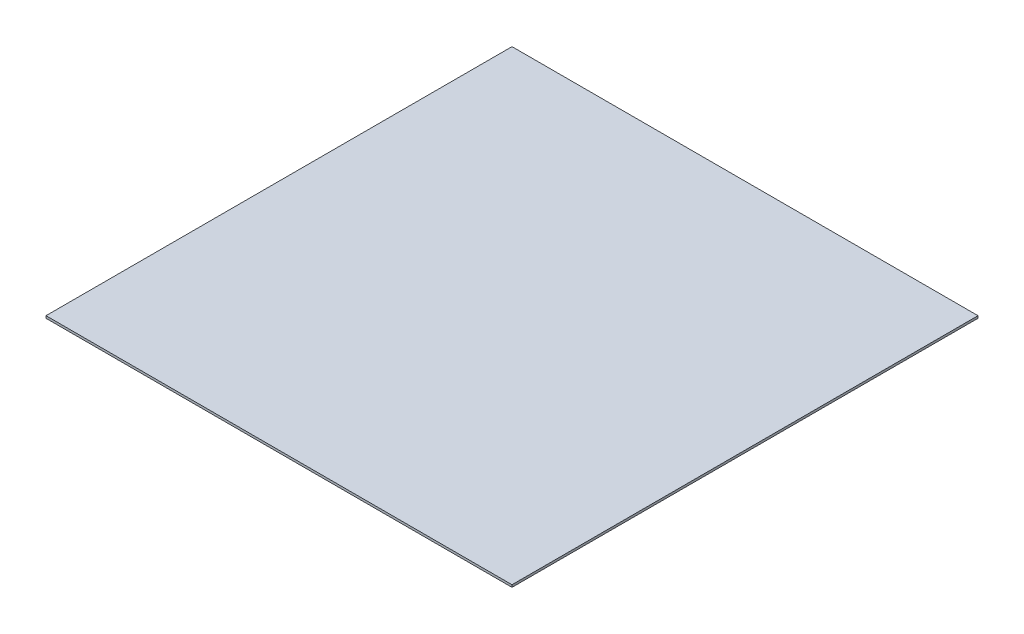
ISO-10303-21;
HEADER;
FILE_DESCRIPTION(('STEP AP214'),'2;1');
FILE_NAME('part.step','',(''),(''),'','','');
FILE_SCHEMA(('AUTOMOTIVE_DESIGN { 1 0 10303 214 1 1 1 1 }'));
ENDSEC;
DATA;
#1=APPLICATION_CONTEXT('core data for automotive mechanical design processes');
#2=APPLICATION_PROTOCOL_DEFINITION('international standard','automotive_design',2000,#1);
#3=PRODUCT_CONTEXT('',#1,'mechanical');
#4=PRODUCT('Part','Part','',(#3));
#5=PRODUCT_RELATED_PRODUCT_CATEGORY('part','',(#4));
#6=PRODUCT_DEFINITION_FORMATION('','',#4);
#7=PRODUCT_DEFINITION_CONTEXT('part definition',#1,'design');
#8=PRODUCT_DEFINITION('design','',#6,#7);
#9=PRODUCT_DEFINITION_SHAPE('','',#8);
#10=(LENGTH_UNIT() NAMED_UNIT(*) SI_UNIT(.MILLI.,.METRE.));
#11=(NAMED_UNIT(*) PLANE_ANGLE_UNIT() SI_UNIT($,.RADIAN.));
#12=(NAMED_UNIT(*) SI_UNIT($,.STERADIAN.) SOLID_ANGLE_UNIT());
#13=UNCERTAINTY_MEASURE_WITH_UNIT(LENGTH_MEASURE(1.E-05),#10,'distance_accuracy_value','');
#14=(GEOMETRIC_REPRESENTATION_CONTEXT(3) GLOBAL_UNCERTAINTY_ASSIGNED_CONTEXT((#13)) GLOBAL_UNIT_ASSIGNED_CONTEXT((#10,
#11,#12)) REPRESENTATION_CONTEXT('',''));
#15=CARTESIAN_POINT('',(0.,0.,0.));
#16=DIRECTION('',(0.,0.,1.));
#17=DIRECTION('',(1.,0.,0.));
#18=AXIS2_PLACEMENT_3D('',#15,#16,#17);
#19=CARTESIAN_POINT('',(-152.,1.5,152.));
#20=DIRECTION('',(1.,0.,0.));
#21=DIRECTION('',(0.,0.,-1.));
#22=AXIS2_PLACEMENT_3D('',#19,#20,#21);
#23=PLANE('',#22);
#24=DIRECTION('',(0.,0.,1.));
#25=VECTOR('',#24,1.);
#26=CARTESIAN_POINT('',(-152.,0.,152.));
#27=LINE('',#26,#25);
#28=CARTESIAN_POINT('',(-152.,0.,-152.));
#29=VERTEX_POINT('',#28);
#30=CARTESIAN_POINT('',(-152.,0.,152.));
#31=VERTEX_POINT('',#30);
#32=EDGE_CURVE('E97',#29,#31,#27,.T.);
#33=ORIENTED_EDGE('',*,*,#32,.T.);
#34=DIRECTION('',(0.,-1.,0.));
#35=VECTOR('',#34,1.);
#36=CARTESIAN_POINT('',(-152.,1.5,152.));
#37=LINE('',#36,#35);
#38=CARTESIAN_POINT('',(-152.,1.5,152.));
#39=VERTEX_POINT('',#38);
#40=EDGE_CURVE('E11',#39,#31,#37,.T.);
#41=ORIENTED_EDGE('',*,*,#40,.F.);
#42=DIRECTION('',(0.,0.,1.));
#43=VECTOR('',#42,1.);
#44=CARTESIAN_POINT('',(-152.,1.5,152.));
#45=LINE('',#44,#43);
#46=CARTESIAN_POINT('',(-152.,1.5,-152.));
#47=VERTEX_POINT('',#46);
#48=EDGE_CURVE('E85',#47,#39,#45,.T.);
#49=ORIENTED_EDGE('',*,*,#48,.F.);
#50=DIRECTION('',(0.,-1.,0.));
#51=VECTOR('',#50,1.);
#52=CARTESIAN_POINT('',(-152.,1.5,-152.));
#53=LINE('',#52,#51);
#54=EDGE_CURVE('E93',#47,#29,#53,.T.);
#55=ORIENTED_EDGE('',*,*,#54,.T.);
#56=EDGE_LOOP('',(#33,#41,#49,#55));
#57=FACE_BOUND('',#56,.T.);
#58=ADVANCED_FACE('F34',(#57),#23,.F.);
#59=CARTESIAN_POINT('',(152.,1.5,152.));
#60=DIRECTION('',(0.,0.,-1.));
#61=DIRECTION('',(-1.,0.,0.));
#62=AXIS2_PLACEMENT_3D('',#59,#60,#61);
#63=PLANE('',#62);
#64=DIRECTION('',(1.,0.,0.));
#65=VECTOR('',#64,1.);
#66=CARTESIAN_POINT('',(152.,0.,152.));
#67=LINE('',#66,#65);
#68=CARTESIAN_POINT('',(152.,0.,152.));
#69=VERTEX_POINT('',#68);
#70=EDGE_CURVE('E89',#31,#69,#67,.T.);
#71=ORIENTED_EDGE('',*,*,#70,.T.);
#72=DIRECTION('',(0.,-1.,0.));
#73=VECTOR('',#72,1.);
#74=CARTESIAN_POINT('',(152.,1.5,152.));
#75=LINE('',#74,#73);
#76=CARTESIAN_POINT('',(152.,1.5,152.));
#77=VERTEX_POINT('',#76);
#78=EDGE_CURVE('E42',#77,#69,#75,.T.);
#79=ORIENTED_EDGE('',*,*,#78,.F.);
#80=DIRECTION('',(1.,0.,0.));
#81=VECTOR('',#80,1.);
#82=CARTESIAN_POINT('',(152.,1.5,152.));
#83=LINE('',#82,#81);
#84=EDGE_CURVE('E80',#39,#77,#83,.T.);
#85=ORIENTED_EDGE('',*,*,#84,.F.);
#86=ORIENTED_EDGE('',*,*,#40,.T.);
#87=EDGE_LOOP('',(#71,#79,#85,#86));
#88=FACE_BOUND('',#87,.T.);
#89=ADVANCED_FACE('F88',(#88),#63,.F.);
#90=CARTESIAN_POINT('',(152.,1.5,152.));
#91=DIRECTION('',(-1.,0.,0.));
#92=DIRECTION('',(0.,0.,1.));
#93=AXIS2_PLACEMENT_3D('',#90,#91,#92);
#94=PLANE('',#93);
#95=DIRECTION('',(0.,0.,-1.));
#96=VECTOR('',#95,1.);
#97=CARTESIAN_POINT('',(152.,0.,152.));
#98=LINE('',#97,#96);
#99=CARTESIAN_POINT('',(152.,0.,-152.));
#100=VERTEX_POINT('',#99);
#101=EDGE_CURVE('E67',#69,#100,#98,.T.);
#102=ORIENTED_EDGE('',*,*,#101,.T.);
#103=DIRECTION('',(0.,-1.,0.));
#104=VECTOR('',#103,1.);
#105=CARTESIAN_POINT('',(152.,1.5,-152.));
#106=LINE('',#105,#104);
#107=CARTESIAN_POINT('',(152.,1.5,-152.));
#108=VERTEX_POINT('',#107);
#109=EDGE_CURVE('E90',#108,#100,#106,.T.);
#110=ORIENTED_EDGE('',*,*,#109,.F.);
#111=DIRECTION('',(0.,0.,-1.));
#112=VECTOR('',#111,1.);
#113=CARTESIAN_POINT('',(152.,1.5,152.));
#114=LINE('',#113,#112);
#115=EDGE_CURVE('E83',#77,#108,#114,.T.);
#116=ORIENTED_EDGE('',*,*,#115,.F.);
#117=ORIENTED_EDGE('',*,*,#78,.T.);
#118=EDGE_LOOP('',(#102,#110,#116,#117));
#119=FACE_BOUND('',#118,.T.);
#120=ADVANCED_FACE('F91',(#119),#94,.F.);
#121=CARTESIAN_POINT('',(152.,1.5,-152.));
#122=DIRECTION('',(0.,0.,1.));
#123=DIRECTION('',(1.,0.,0.));
#124=AXIS2_PLACEMENT_3D('',#121,#122,#123);
#125=PLANE('',#124);
#126=DIRECTION('',(-1.,0.,0.));
#127=VECTOR('',#126,1.);
#128=CARTESIAN_POINT('',(152.,0.,-152.));
#129=LINE('',#128,#127);
#130=EDGE_CURVE('E73',#100,#29,#129,.T.);
#131=ORIENTED_EDGE('',*,*,#130,.T.);
#132=ORIENTED_EDGE('',*,*,#54,.F.);
#133=DIRECTION('',(-1.,0.,0.));
#134=VECTOR('',#133,1.);
#135=CARTESIAN_POINT('',(152.,1.5,-152.));
#136=LINE('',#135,#134);
#137=EDGE_CURVE('E50',#108,#47,#136,.T.);
#138=ORIENTED_EDGE('',*,*,#137,.F.);
#139=ORIENTED_EDGE('',*,*,#109,.T.);
#140=EDGE_LOOP('',(#131,#132,#138,#139));
#141=FACE_BOUND('',#140,.T.);
#142=ADVANCED_FACE('F104',(#141),#125,.F.);
#143=CARTESIAN_POINT('',(0.,1.5,0.));
#144=DIRECTION('',(0.,1.,0.));
#145=DIRECTION('',(0.,0.,1.));
#146=AXIS2_PLACEMENT_3D('',#143,#144,#145);
#147=PLANE('',#146);
#148=ORIENTED_EDGE('',*,*,#48,.T.);
#149=ORIENTED_EDGE('',*,*,#84,.T.);
#150=ORIENTED_EDGE('',*,*,#115,.T.);
#151=ORIENTED_EDGE('',*,*,#137,.T.);
#152=EDGE_LOOP('',(#148,#149,#150,#151));
#153=FACE_BOUND('',#152,.T.);
#154=ADVANCED_FACE('F81',(#153),#147,.T.);
#155=CARTESIAN_POINT('',(0.,0.,0.));
#156=DIRECTION('',(0.,1.,0.));
#157=DIRECTION('',(0.,0.,1.));
#158=AXIS2_PLACEMENT_3D('',#155,#156,#157);
#159=PLANE('',#158);
#160=ORIENTED_EDGE('',*,*,#32,.F.);
#161=ORIENTED_EDGE('',*,*,#130,.F.);
#162=ORIENTED_EDGE('',*,*,#101,.F.);
#163=ORIENTED_EDGE('',*,*,#70,.F.);
#164=EDGE_LOOP('',(#160,#161,#162,#163));
#165=FACE_BOUND('',#164,.T.);
#166=ADVANCED_FACE('F107',(#165),#159,.F.);
#167=CLOSED_SHELL('',(#58,#89,#120,#142,#154,#166));
#168=MANIFOLD_SOLID_BREP('B2',#167);
#169=ADVANCED_BREP_SHAPE_REPRESENTATION('',(#18,#168),#14);
#170=SHAPE_DEFINITION_REPRESENTATION(#9,#169);
ENDSEC;
END-ISO-10303-21;
